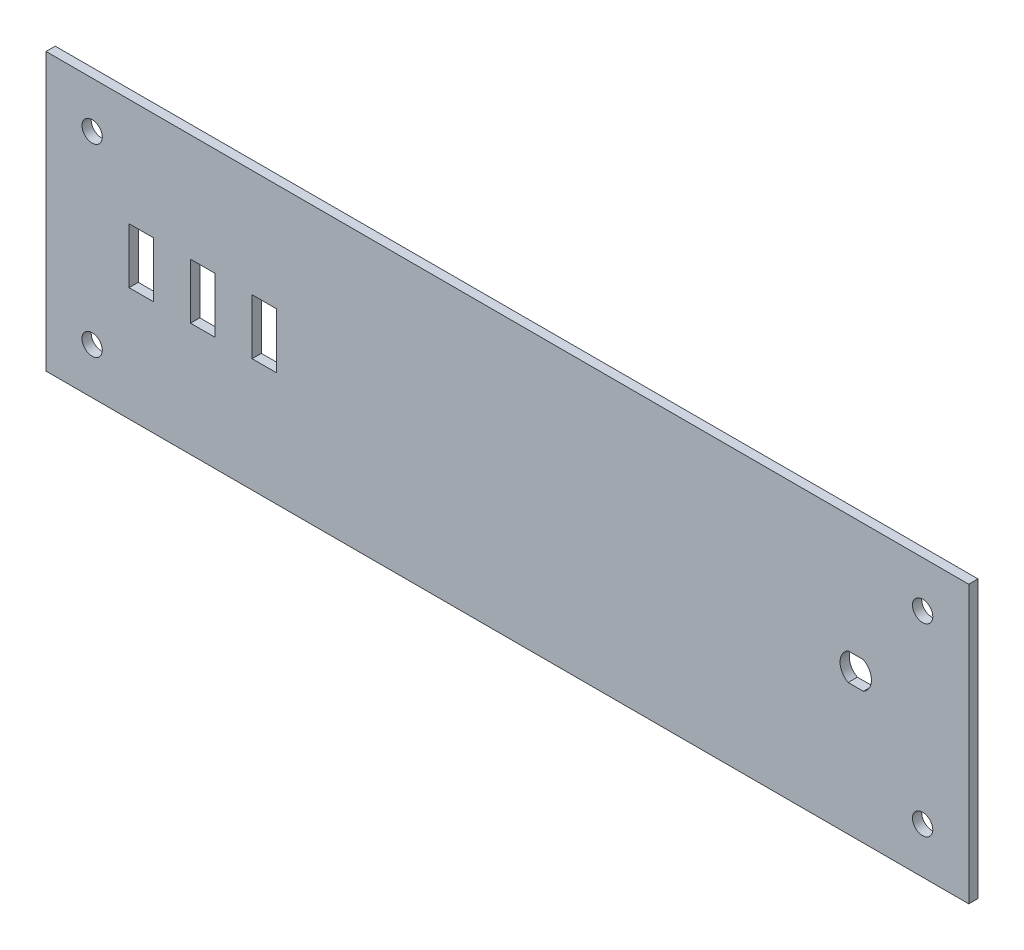
ISO-10303-21;
HEADER;
FILE_DESCRIPTION(('STEP AP214'),'2;1');
FILE_NAME('part.step','',(''),(''),'','','');
FILE_SCHEMA(('AUTOMOTIVE_DESIGN { 1 0 10303 214 1 1 1 1 }'));
ENDSEC;
DATA;
#1=APPLICATION_CONTEXT('core data for automotive mechanical design processes');
#2=APPLICATION_PROTOCOL_DEFINITION('international standard','automotive_design',2000,#1);
#3=PRODUCT_CONTEXT('',#1,'mechanical');
#4=PRODUCT('Part','Part','',(#3));
#5=PRODUCT_RELATED_PRODUCT_CATEGORY('part','',(#4));
#6=PRODUCT_DEFINITION_FORMATION('','',#4);
#7=PRODUCT_DEFINITION_CONTEXT('part definition',#1,'design');
#8=PRODUCT_DEFINITION('design','',#6,#7);
#9=PRODUCT_DEFINITION_SHAPE('','',#8);
#10=(LENGTH_UNIT() NAMED_UNIT(*) SI_UNIT(.MILLI.,.METRE.));
#11=(NAMED_UNIT(*) PLANE_ANGLE_UNIT() SI_UNIT($,.RADIAN.));
#12=(NAMED_UNIT(*) SI_UNIT($,.STERADIAN.) SOLID_ANGLE_UNIT());
#13=UNCERTAINTY_MEASURE_WITH_UNIT(LENGTH_MEASURE(1.E-05),#10,'distance_accuracy_value','');
#14=(GEOMETRIC_REPRESENTATION_CONTEXT(3) GLOBAL_UNCERTAINTY_ASSIGNED_CONTEXT((#13)) GLOBAL_UNIT_ASSIGNED_CONTEXT((#10,
#11,#12)) REPRESENTATION_CONTEXT('',''));
#15=CARTESIAN_POINT('',(0.,0.,0.));
#16=DIRECTION('',(0.,0.,1.));
#17=DIRECTION('',(1.,0.,0.));
#18=AXIS2_PLACEMENT_3D('',#15,#16,#17);
#19=CARTESIAN_POINT('',(-300.,15.0007500092795,3.));
#20=DIRECTION('',(1.,0.,0.));
#21=DIRECTION('',(0.,0.,-1.));
#22=AXIS2_PLACEMENT_3D('',#19,#20,#21);
#23=PLANE('',#22);
#24=DIRECTION('',(0.,-1.,0.));
#25=VECTOR('',#24,1.);
#26=CARTESIAN_POINT('',(-300.,15.0007500092795,0.));
#27=LINE('',#26,#25);
#28=CARTESIAN_POINT('',(-300.,15.0007500092795,0.));
#29=VERTEX_POINT('',#28);
#30=CARTESIAN_POINT('',(-300.,-75.0007499907151,0.));
#31=VERTEX_POINT('',#30);
#32=EDGE_CURVE('E281',#29,#31,#27,.T.);
#33=ORIENTED_EDGE('',*,*,#32,.T.);
#34=DIRECTION('',(0.,0.,-1.));
#35=VECTOR('',#34,1.);
#36=CARTESIAN_POINT('',(-300.,-75.0007499907151,3.));
#37=LINE('',#36,#35);
#38=CARTESIAN_POINT('',(-300.,-75.0007499907151,3.));
#39=VERTEX_POINT('',#38);
#40=EDGE_CURVE('E310',#39,#31,#37,.T.);
#41=ORIENTED_EDGE('',*,*,#40,.F.);
#42=DIRECTION('',(0.,-1.,0.));
#43=VECTOR('',#42,1.);
#44=CARTESIAN_POINT('',(-300.,15.0007500092795,3.));
#45=LINE('',#44,#43);
#46=CARTESIAN_POINT('',(-300.,15.0007500092795,3.));
#47=VERTEX_POINT('',#46);
#48=EDGE_CURVE('E282',#47,#39,#45,.T.);
#49=ORIENTED_EDGE('',*,*,#48,.F.);
#50=DIRECTION('',(0.,0.,-1.));
#51=VECTOR('',#50,1.);
#52=CARTESIAN_POINT('',(-300.,15.0007500092795,3.));
#53=LINE('',#52,#51);
#54=EDGE_CURVE('E294',#47,#29,#53,.T.);
#55=ORIENTED_EDGE('',*,*,#54,.T.);
#56=EDGE_LOOP('',(#33,#41,#49,#55));
#57=FACE_BOUND('',#56,.T.);
#58=ADVANCED_FACE('F33',(#57),#23,.F.);
#59=CARTESIAN_POINT('',(-300.,-75.0007499907151,3.));
#60=DIRECTION('',(0.,1.,0.));
#61=DIRECTION('',(0.,0.,1.));
#62=AXIS2_PLACEMENT_3D('',#59,#60,#61);
#63=PLANE('',#62);
#64=DIRECTION('',(1.,0.,0.));
#65=VECTOR('',#64,1.);
#66=CARTESIAN_POINT('',(-300.,-75.0007499907151,0.));
#67=LINE('',#66,#65);
#68=CARTESIAN_POINT('',(0.,-75.0007499907151,0.));
#69=VERTEX_POINT('',#68);
#70=EDGE_CURVE('E297',#31,#69,#67,.T.);
#71=ORIENTED_EDGE('',*,*,#70,.T.);
#72=DIRECTION('',(0.,0.,-1.));
#73=VECTOR('',#72,1.);
#74=CARTESIAN_POINT('',(0.,-75.0007499907151,3.));
#75=LINE('',#74,#73);
#76=CARTESIAN_POINT('',(0.,-75.0007499907151,3.));
#77=VERTEX_POINT('',#76);
#78=EDGE_CURVE('E308',#77,#69,#75,.T.);
#79=ORIENTED_EDGE('',*,*,#78,.F.);
#80=DIRECTION('',(1.,0.,0.));
#81=VECTOR('',#80,1.);
#82=CARTESIAN_POINT('',(-300.,-75.0007499907151,3.));
#83=LINE('',#82,#81);
#84=EDGE_CURVE('E285',#39,#77,#83,.T.);
#85=ORIENTED_EDGE('',*,*,#84,.F.);
#86=ORIENTED_EDGE('',*,*,#40,.T.);
#87=EDGE_LOOP('',(#71,#79,#85,#86));
#88=FACE_BOUND('',#87,.T.);
#89=ADVANCED_FACE('F373',(#88),#63,.F.);
#90=CARTESIAN_POINT('',(0.,15.0007500092795,3.));
#91=DIRECTION('',(1.,0.,0.));
#92=DIRECTION('',(0.,0.,-1.));
#93=AXIS2_PLACEMENT_3D('',#90,#91,#92);
#94=PLANE('',#93);
#95=DIRECTION('',(0.,-1.,0.));
#96=VECTOR('',#95,1.);
#97=CARTESIAN_POINT('',(0.,15.0007500092795,0.));
#98=LINE('',#97,#96);
#99=CARTESIAN_POINT('',(0.,15.0007500092795,0.));
#100=VERTEX_POINT('',#99);
#101=EDGE_CURVE('E300',#100,#69,#98,.T.);
#102=ORIENTED_EDGE('',*,*,#101,.F.);
#103=DIRECTION('',(0.,0.,-1.));
#104=VECTOR('',#103,1.);
#105=CARTESIAN_POINT('',(0.,15.0007500092795,3.));
#106=LINE('',#105,#104);
#107=CARTESIAN_POINT('',(0.,15.0007500092795,3.));
#108=VERTEX_POINT('',#107);
#109=EDGE_CURVE('E306',#108,#100,#106,.T.);
#110=ORIENTED_EDGE('',*,*,#109,.F.);
#111=DIRECTION('',(0.,-1.,0.));
#112=VECTOR('',#111,1.);
#113=CARTESIAN_POINT('',(0.,15.0007500092795,3.));
#114=LINE('',#113,#112);
#115=EDGE_CURVE('E288',#108,#77,#114,.T.);
#116=ORIENTED_EDGE('',*,*,#115,.T.);
#117=ORIENTED_EDGE('',*,*,#78,.T.);
#118=EDGE_LOOP('',(#102,#110,#116,#117));
#119=FACE_BOUND('',#118,.T.);
#120=ADVANCED_FACE('F378',(#119),#94,.T.);
#121=CARTESIAN_POINT('',(-300.,15.0007500092795,3.));
#122=DIRECTION('',(0.,1.,0.));
#123=DIRECTION('',(0.,0.,1.));
#124=AXIS2_PLACEMENT_3D('',#121,#122,#123);
#125=PLANE('',#124);
#126=DIRECTION('',(1.,0.,0.));
#127=VECTOR('',#126,1.);
#128=CARTESIAN_POINT('',(-300.,15.0007500092795,0.));
#129=LINE('',#128,#127);
#130=EDGE_CURVE('E286',#29,#100,#129,.T.);
#131=ORIENTED_EDGE('',*,*,#130,.F.);
#132=ORIENTED_EDGE('',*,*,#54,.F.);
#133=DIRECTION('',(1.,0.,0.));
#134=VECTOR('',#133,1.);
#135=CARTESIAN_POINT('',(-300.,15.0007500092795,3.));
#136=LINE('',#135,#134);
#137=EDGE_CURVE('E291',#47,#108,#136,.T.);
#138=ORIENTED_EDGE('',*,*,#137,.T.);
#139=ORIENTED_EDGE('',*,*,#109,.T.);
#140=EDGE_LOOP('',(#131,#132,#138,#139));
#141=FACE_BOUND('',#140,.T.);
#142=ADVANCED_FACE('F386',(#141),#125,.T.);
#143=CARTESIAN_POINT('',(0.,0.,3.));
#144=DIRECTION('',(0.,0.,1.));
#145=DIRECTION('',(1.,0.,0.));
#146=AXIS2_PLACEMENT_3D('',#143,#144,#145);
#147=PLANE('',#146);
#148=CARTESIAN_POINT('',(-36.7467376716554,-27.8300726435288,3.));
#149=DIRECTION('',(0.,0.,1.));
#150=DIRECTION('',(1.,0.,0.));
#151=AXIS2_PLACEMENT_3D('',#148,#149,#150);
#152=CIRCLE('',#151,5.1);
#153=CARTESIAN_POINT('',(-34.2552521709952,-32.2800726435288,3.));
#154=VERTEX_POINT('',#153);
#155=CARTESIAN_POINT('',(-34.2552521709952,-23.3800726435288,3.));
#156=VERTEX_POINT('',#155);
#157=EDGE_CURVE('E47',#154,#156,#152,.T.);
#158=ORIENTED_EDGE('',*,*,#157,.F.);
#159=DIRECTION('',(1.,0.,0.));
#160=VECTOR('',#159,1.);
#161=CARTESIAN_POINT('',(-34.2552521709952,-32.2800726435288,3.));
#162=LINE('',#161,#160);
#163=CARTESIAN_POINT('',(-39.2382231723156,-32.2800726435288,3.));
#164=VERTEX_POINT('',#163);
#165=EDGE_CURVE('E188',#164,#154,#162,.T.);
#166=ORIENTED_EDGE('',*,*,#165,.F.);
#167=CARTESIAN_POINT('',(-36.7467376716554,-27.8300726435288,3.));
#168=DIRECTION('',(0.,0.,1.));
#169=DIRECTION('',(1.,0.,0.));
#170=AXIS2_PLACEMENT_3D('',#167,#168,#169);
#171=CIRCLE('',#170,5.1);
#172=CARTESIAN_POINT('',(-39.2382231723156,-23.3800726435288,3.));
#173=VERTEX_POINT('',#172);
#174=EDGE_CURVE('E172',#173,#164,#171,.T.);
#175=ORIENTED_EDGE('',*,*,#174,.F.);
#176=DIRECTION('',(-1.,0.,0.));
#177=VECTOR('',#176,1.);
#178=CARTESIAN_POINT('',(-34.2552521709952,-23.3800726435288,3.));
#179=LINE('',#178,#177);
#180=EDGE_CURVE('E181',#156,#173,#179,.T.);
#181=ORIENTED_EDGE('',*,*,#180,.F.);
#182=EDGE_LOOP('',(#158,#166,#175,#181));
#183=FACE_BOUND('',#182,.T.);
#184=DIRECTION('',(0.,1.,0.));
#185=VECTOR('',#184,1.);
#186=CARTESIAN_POINT('',(-265.,-19.9992499907157,3.));
#187=LINE('',#186,#185);
#188=CARTESIAN_POINT('',(-265.,-37.9992499907156,3.));
#189=VERTEX_POINT('',#188);
#190=CARTESIAN_POINT('',(-265.,-19.9992499907157,3.));
#191=VERTEX_POINT('',#190);
#192=EDGE_CURVE('E198',#189,#191,#187,.T.);
#193=ORIENTED_EDGE('',*,*,#192,.F.);
#194=DIRECTION('',(1.,0.,0.));
#195=VECTOR('',#194,1.);
#196=CARTESIAN_POINT('',(-265.,-37.9992499907156,3.));
#197=LINE('',#196,#195);
#198=CARTESIAN_POINT('',(-273.,-37.9992499907156,3.));
#199=VERTEX_POINT('',#198);
#200=EDGE_CURVE('E207',#199,#189,#197,.T.);
#201=ORIENTED_EDGE('',*,*,#200,.F.);
#202=DIRECTION('',(0.,-1.,0.));
#203=VECTOR('',#202,1.);
#204=CARTESIAN_POINT('',(-273.,-19.9992499907157,3.));
#205=LINE('',#204,#203);
#206=CARTESIAN_POINT('',(-273.,-19.9992499907157,3.));
#207=VERTEX_POINT('',#206);
#208=EDGE_CURVE('E204',#207,#199,#205,.T.);
#209=ORIENTED_EDGE('',*,*,#208,.F.);
#210=DIRECTION('',(-1.,0.,0.));
#211=VECTOR('',#210,1.);
#212=CARTESIAN_POINT('',(-265.,-19.9992499907157,3.));
#213=LINE('',#212,#211);
#214=EDGE_CURVE('E200',#191,#207,#213,.T.);
#215=ORIENTED_EDGE('',*,*,#214,.F.);
#216=EDGE_LOOP('',(#193,#201,#209,#215));
#217=FACE_BOUND('',#216,.T.);
#218=DIRECTION('',(-1.,0.,0.));
#219=VECTOR('',#218,1.);
#220=CARTESIAN_POINT('',(-245.,-19.9992499907157,3.));
#221=LINE('',#220,#219);
#222=CARTESIAN_POINT('',(-245.,-19.9992499907157,3.));
#223=VERTEX_POINT('',#222);
#224=CARTESIAN_POINT('',(-253.,-19.9992499907157,3.));
#225=VERTEX_POINT('',#224);
#226=EDGE_CURVE('E220',#223,#225,#221,.T.);
#227=ORIENTED_EDGE('',*,*,#226,.F.);
#228=DIRECTION('',(0.,1.,0.));
#229=VECTOR('',#228,1.);
#230=CARTESIAN_POINT('',(-245.,-19.9992499907157,3.));
#231=LINE('',#230,#229);
#232=CARTESIAN_POINT('',(-245.,-37.9992499907156,3.));
#233=VERTEX_POINT('',#232);
#234=EDGE_CURVE('E229',#233,#223,#231,.T.);
#235=ORIENTED_EDGE('',*,*,#234,.F.);
#236=DIRECTION('',(1.,0.,0.));
#237=VECTOR('',#236,1.);
#238=CARTESIAN_POINT('',(-245.,-37.9992499907156,3.));
#239=LINE('',#238,#237);
#240=CARTESIAN_POINT('',(-253.,-37.9992499907156,3.));
#241=VERTEX_POINT('',#240);
#242=EDGE_CURVE('E226',#241,#233,#239,.T.);
#243=ORIENTED_EDGE('',*,*,#242,.F.);
#244=DIRECTION('',(0.,-1.,0.));
#245=VECTOR('',#244,1.);
#246=CARTESIAN_POINT('',(-253.,-19.9992499907157,3.));
#247=LINE('',#246,#245);
#248=EDGE_CURVE('E222',#225,#241,#247,.T.);
#249=ORIENTED_EDGE('',*,*,#248,.F.);
#250=EDGE_LOOP('',(#227,#235,#243,#249));
#251=FACE_BOUND('',#250,.T.);
#252=DIRECTION('',(-1.,0.,0.));
#253=VECTOR('',#252,1.);
#254=CARTESIAN_POINT('',(-225.,-19.9992499907157,3.));
#255=LINE('',#254,#253);
#256=CARTESIAN_POINT('',(-225.,-19.9992499907157,3.));
#257=VERTEX_POINT('',#256);
#258=CARTESIAN_POINT('',(-233.,-19.9992499907157,3.));
#259=VERTEX_POINT('',#258);
#260=EDGE_CURVE('E195',#257,#259,#255,.T.);
#261=ORIENTED_EDGE('',*,*,#260,.F.);
#262=DIRECTION('',(0.,1.,0.));
#263=VECTOR('',#262,1.);
#264=CARTESIAN_POINT('',(-225.,-19.9992499907157,3.));
#265=LINE('',#264,#263);
#266=CARTESIAN_POINT('',(-225.,-37.9992499907156,3.));
#267=VERTEX_POINT('',#266);
#268=EDGE_CURVE('E247',#267,#257,#265,.T.);
#269=ORIENTED_EDGE('',*,*,#268,.F.);
#270=DIRECTION('',(1.,0.,0.));
#271=VECTOR('',#270,1.);
#272=CARTESIAN_POINT('',(-225.,-37.9992499907156,3.));
#273=LINE('',#272,#271);
#274=CARTESIAN_POINT('',(-233.,-37.9992499907156,3.));
#275=VERTEX_POINT('',#274);
#276=EDGE_CURVE('E244',#275,#267,#273,.T.);
#277=ORIENTED_EDGE('',*,*,#276,.F.);
#278=DIRECTION('',(0.,-1.,0.));
#279=VECTOR('',#278,1.);
#280=CARTESIAN_POINT('',(-233.,-19.9992499907157,3.));
#281=LINE('',#280,#279);
#282=EDGE_CURVE('E241',#259,#275,#281,.T.);
#283=ORIENTED_EDGE('',*,*,#282,.F.);
#284=EDGE_LOOP('',(#261,#269,#277,#283));
#285=FACE_BOUND('',#284,.T.);
#286=CARTESIAN_POINT('',(-15.,0.000750009279487651,3.));
#287=DIRECTION('',(0.,0.,1.));
#288=DIRECTION('',(1.,0.,0.));
#289=AXIS2_PLACEMENT_3D('',#286,#287,#288);
#290=CIRCLE('',#289,3.3);
#291=CARTESIAN_POINT('',(-11.7,0.000750009279487651,3.));
#292=VERTEX_POINT('',#291);
#293=EDGE_CURVE('E213',#292,#292,#290,.T.);
#294=ORIENTED_EDGE('',*,*,#293,.F.);
#295=EDGE_LOOP('',(#294));
#296=FACE_BOUND('',#295,.T.);
#297=CARTESIAN_POINT('',(-15.,-60.0007499907151,3.));
#298=DIRECTION('',(0.,0.,1.));
#299=DIRECTION('',(1.,0.,0.));
#300=AXIS2_PLACEMENT_3D('',#297,#298,#299);
#301=CIRCLE('',#300,3.3);
#302=CARTESIAN_POINT('',(-11.7,-60.0007499907151,3.));
#303=VERTEX_POINT('',#302);
#304=EDGE_CURVE('E263',#303,#303,#301,.T.);
#305=ORIENTED_EDGE('',*,*,#304,.F.);
#306=EDGE_LOOP('',(#305));
#307=FACE_BOUND('',#306,.T.);
#308=CARTESIAN_POINT('',(-285.,-60.0007499907151,3.));
#309=DIRECTION('',(0.,0.,1.));
#310=DIRECTION('',(1.,0.,0.));
#311=AXIS2_PLACEMENT_3D('',#308,#309,#310);
#312=CIRCLE('',#311,3.30000000000003);
#313=CARTESIAN_POINT('',(-281.7,-60.0007499907151,3.));
#314=VERTEX_POINT('',#313);
#315=EDGE_CURVE('E269',#314,#314,#312,.T.);
#316=ORIENTED_EDGE('',*,*,#315,.F.);
#317=EDGE_LOOP('',(#316));
#318=FACE_BOUND('',#317,.T.);
#319=CARTESIAN_POINT('',(-285.000000000002,0.000750009286901859,3.));
#320=DIRECTION('',(0.,0.,1.));
#321=DIRECTION('',(1.,0.,0.));
#322=AXIS2_PLACEMENT_3D('',#319,#320,#321);
#323=CIRCLE('',#322,3.30000000000003);
#324=CARTESIAN_POINT('',(-281.700000000002,0.000750009286901859,3.));
#325=VERTEX_POINT('',#324);
#326=EDGE_CURVE('E275',#325,#325,#323,.T.);
#327=ORIENTED_EDGE('',*,*,#326,.F.);
#328=EDGE_LOOP('',(#327));
#329=FACE_BOUND('',#328,.T.);
#330=ORIENTED_EDGE('',*,*,#48,.T.);
#331=ORIENTED_EDGE('',*,*,#84,.T.);
#332=ORIENTED_EDGE('',*,*,#115,.F.);
#333=ORIENTED_EDGE('',*,*,#137,.F.);
#334=EDGE_LOOP('',(#330,#331,#332,#333));
#335=FACE_BOUND('',#334,.T.);
#336=ADVANCED_FACE('F185',(#183,#217,#251,#285,#296,#307,#318,#329,#335),#147,.T.);
#337=CARTESIAN_POINT('',(0.,0.,0.));
#338=DIRECTION('',(0.,0.,1.));
#339=DIRECTION('',(1.,0.,0.));
#340=AXIS2_PLACEMENT_3D('',#337,#338,#339);
#341=PLANE('',#340);
#342=DIRECTION('',(1.,0.,0.));
#343=VECTOR('',#342,1.);
#344=CARTESIAN_POINT('',(0.,-32.2800726435288,0.));
#345=LINE('',#344,#343);
#346=CARTESIAN_POINT('',(-39.2382231723156,-32.2800726435288,0.));
#347=VERTEX_POINT('',#346);
#348=CARTESIAN_POINT('',(-34.2552521709952,-32.2800726435288,0.));
#349=VERTEX_POINT('',#348);
#350=EDGE_CURVE('E40',#347,#349,#345,.T.);
#351=ORIENTED_EDGE('',*,*,#350,.T.);
#352=CARTESIAN_POINT('',(-36.7467376716554,-27.8300726435288,0.));
#353=DIRECTION('',(0.,0.,1.));
#354=DIRECTION('',(1.,0.,0.));
#355=AXIS2_PLACEMENT_3D('',#352,#353,#354);
#356=CIRCLE('',#355,5.1);
#357=CARTESIAN_POINT('',(-34.2552521709952,-23.3800726435288,0.));
#358=VERTEX_POINT('',#357);
#359=EDGE_CURVE('E11',#349,#358,#356,.T.);
#360=ORIENTED_EDGE('',*,*,#359,.T.);
#361=DIRECTION('',(-1.,0.,0.));
#362=VECTOR('',#361,1.);
#363=CARTESIAN_POINT('',(0.,-23.3800726435288,0.));
#364=LINE('',#363,#362);
#365=CARTESIAN_POINT('',(-39.2382231723156,-23.3800726435288,0.));
#366=VERTEX_POINT('',#365);
#367=EDGE_CURVE('E349',#358,#366,#364,.T.);
#368=ORIENTED_EDGE('',*,*,#367,.T.);
#369=CARTESIAN_POINT('',(-36.7467376716554,-27.8300726435288,0.));
#370=DIRECTION('',(0.,0.,1.));
#371=DIRECTION('',(1.,0.,0.));
#372=AXIS2_PLACEMENT_3D('',#369,#370,#371);
#373=CIRCLE('',#372,5.1);
#374=EDGE_CURVE('E175',#366,#347,#373,.T.);
#375=ORIENTED_EDGE('',*,*,#374,.T.);
#376=EDGE_LOOP('',(#351,#360,#368,#375));
#377=FACE_BOUND('',#376,.T.);
#378=DIRECTION('',(1.,0.,0.));
#379=VECTOR('',#378,1.);
#380=CARTESIAN_POINT('',(0.,-37.9992499907156,0.));
#381=LINE('',#380,#379);
#382=CARTESIAN_POINT('',(-273.,-37.9992499907156,0.));
#383=VERTEX_POINT('',#382);
#384=CARTESIAN_POINT('',(-265.,-37.9992499907156,0.));
#385=VERTEX_POINT('',#384);
#386=EDGE_CURVE('E343',#383,#385,#381,.T.);
#387=ORIENTED_EDGE('',*,*,#386,.T.);
#388=DIRECTION('',(0.,1.,0.));
#389=VECTOR('',#388,1.);
#390=CARTESIAN_POINT('',(-265.,0.,0.));
#391=LINE('',#390,#389);
#392=CARTESIAN_POINT('',(-265.,-19.9992499907157,0.));
#393=VERTEX_POINT('',#392);
#394=EDGE_CURVE('E346',#385,#393,#391,.T.);
#395=ORIENTED_EDGE('',*,*,#394,.T.);
#396=DIRECTION('',(-1.,0.,0.));
#397=VECTOR('',#396,1.);
#398=CARTESIAN_POINT('',(0.,-19.9992499907157,0.));
#399=LINE('',#398,#397);
#400=CARTESIAN_POINT('',(-273.,-19.9992499907157,0.));
#401=VERTEX_POINT('',#400);
#402=EDGE_CURVE('E337',#393,#401,#399,.T.);
#403=ORIENTED_EDGE('',*,*,#402,.T.);
#404=DIRECTION('',(0.,-1.,0.));
#405=VECTOR('',#404,1.);
#406=CARTESIAN_POINT('',(-273.,0.,0.));
#407=LINE('',#406,#405);
#408=EDGE_CURVE('E340',#401,#383,#407,.T.);
#409=ORIENTED_EDGE('',*,*,#408,.T.);
#410=EDGE_LOOP('',(#387,#395,#403,#409));
#411=FACE_BOUND('',#410,.T.);
#412=DIRECTION('',(0.,1.,0.));
#413=VECTOR('',#412,1.);
#414=CARTESIAN_POINT('',(-245.,0.,0.));
#415=LINE('',#414,#413);
#416=CARTESIAN_POINT('',(-245.,-37.9992499907156,0.));
#417=VERTEX_POINT('',#416);
#418=CARTESIAN_POINT('',(-245.,-19.9992499907157,0.));
#419=VERTEX_POINT('',#418);
#420=EDGE_CURVE('E331',#417,#419,#415,.T.);
#421=ORIENTED_EDGE('',*,*,#420,.T.);
#422=DIRECTION('',(-1.,0.,0.));
#423=VECTOR('',#422,1.);
#424=CARTESIAN_POINT('',(0.,-19.9992499907157,0.));
#425=LINE('',#424,#423);
#426=CARTESIAN_POINT('',(-253.,-19.9992499907157,0.));
#427=VERTEX_POINT('',#426);
#428=EDGE_CURVE('E334',#419,#427,#425,.T.);
#429=ORIENTED_EDGE('',*,*,#428,.T.);
#430=DIRECTION('',(0.,-1.,0.));
#431=VECTOR('',#430,1.);
#432=CARTESIAN_POINT('',(-253.,0.,0.));
#433=LINE('',#432,#431);
#434=CARTESIAN_POINT('',(-253.,-37.9992499907156,0.));
#435=VERTEX_POINT('',#434);
#436=EDGE_CURVE('E325',#427,#435,#433,.T.);
#437=ORIENTED_EDGE('',*,*,#436,.T.);
#438=DIRECTION('',(1.,0.,0.));
#439=VECTOR('',#438,1.);
#440=CARTESIAN_POINT('',(0.,-37.9992499907156,0.));
#441=LINE('',#440,#439);
#442=EDGE_CURVE('E328',#435,#417,#441,.T.);
#443=ORIENTED_EDGE('',*,*,#442,.T.);
#444=EDGE_LOOP('',(#421,#429,#437,#443));
#445=FACE_BOUND('',#444,.T.);
#446=DIRECTION('',(0.,1.,0.));
#447=VECTOR('',#446,1.);
#448=CARTESIAN_POINT('',(-225.,0.,0.));
#449=LINE('',#448,#447);
#450=CARTESIAN_POINT('',(-225.,-37.9992499907156,0.));
#451=VERTEX_POINT('',#450);
#452=CARTESIAN_POINT('',(-225.,-19.9992499907157,0.));
#453=VERTEX_POINT('',#452);
#454=EDGE_CURVE('E319',#451,#453,#449,.T.);
#455=ORIENTED_EDGE('',*,*,#454,.T.);
#456=DIRECTION('',(-1.,0.,0.));
#457=VECTOR('',#456,1.);
#458=CARTESIAN_POINT('',(0.,-19.9992499907157,0.));
#459=LINE('',#458,#457);
#460=CARTESIAN_POINT('',(-233.,-19.9992499907157,0.));
#461=VERTEX_POINT('',#460);
#462=EDGE_CURVE('E322',#453,#461,#459,.T.);
#463=ORIENTED_EDGE('',*,*,#462,.T.);
#464=DIRECTION('',(0.,-1.,0.));
#465=VECTOR('',#464,1.);
#466=CARTESIAN_POINT('',(-233.,0.,0.));
#467=LINE('',#466,#465);
#468=CARTESIAN_POINT('',(-233.,-37.9992499907156,0.));
#469=VERTEX_POINT('',#468);
#470=EDGE_CURVE('E313',#461,#469,#467,.T.);
#471=ORIENTED_EDGE('',*,*,#470,.T.);
#472=DIRECTION('',(1.,0.,0.));
#473=VECTOR('',#472,1.);
#474=CARTESIAN_POINT('',(0.,-37.9992499907156,0.));
#475=LINE('',#474,#473);
#476=EDGE_CURVE('E316',#469,#451,#475,.T.);
#477=ORIENTED_EDGE('',*,*,#476,.T.);
#478=EDGE_LOOP('',(#455,#463,#471,#477));
#479=FACE_BOUND('',#478,.T.);
#480=CARTESIAN_POINT('',(-15.,0.000750009279487651,0.));
#481=DIRECTION('',(0.,0.,1.));
#482=DIRECTION('',(1.,0.,0.));
#483=AXIS2_PLACEMENT_3D('',#480,#481,#482);
#484=CIRCLE('',#483,3.3);
#485=CARTESIAN_POINT('',(-11.7,0.000750009279487651,0.));
#486=VERTEX_POINT('',#485);
#487=EDGE_CURVE('E260',#486,#486,#484,.T.);
#488=ORIENTED_EDGE('',*,*,#487,.T.);
#489=EDGE_LOOP('',(#488));
#490=FACE_BOUND('',#489,.T.);
#491=CARTESIAN_POINT('',(-15.,-60.0007499907151,0.));
#492=DIRECTION('',(0.,0.,1.));
#493=DIRECTION('',(1.,0.,0.));
#494=AXIS2_PLACEMENT_3D('',#491,#492,#493);
#495=CIRCLE('',#494,3.3);
#496=CARTESIAN_POINT('',(-11.7,-60.0007499907151,0.));
#497=VERTEX_POINT('',#496);
#498=EDGE_CURVE('E266',#497,#497,#495,.T.);
#499=ORIENTED_EDGE('',*,*,#498,.T.);
#500=EDGE_LOOP('',(#499));
#501=FACE_BOUND('',#500,.T.);
#502=CARTESIAN_POINT('',(-285.,-60.0007499907151,0.));
#503=DIRECTION('',(0.,0.,1.));
#504=DIRECTION('',(1.,0.,0.));
#505=AXIS2_PLACEMENT_3D('',#502,#503,#504);
#506=CIRCLE('',#505,3.30000000000003);
#507=CARTESIAN_POINT('',(-281.7,-60.0007499907151,0.));
#508=VERTEX_POINT('',#507);
#509=EDGE_CURVE('E272',#508,#508,#506,.T.);
#510=ORIENTED_EDGE('',*,*,#509,.T.);
#511=EDGE_LOOP('',(#510));
#512=FACE_BOUND('',#511,.T.);
#513=CARTESIAN_POINT('',(-285.000000000002,0.000750009286901859,0.));
#514=DIRECTION('',(0.,0.,1.));
#515=DIRECTION('',(1.,0.,0.));
#516=AXIS2_PLACEMENT_3D('',#513,#514,#515);
#517=CIRCLE('',#516,3.30000000000003);
#518=CARTESIAN_POINT('',(-281.700000000002,0.000750009286901859,0.));
#519=VERTEX_POINT('',#518);
#520=EDGE_CURVE('E278',#519,#519,#517,.T.);
#521=ORIENTED_EDGE('',*,*,#520,.T.);
#522=EDGE_LOOP('',(#521));
#523=FACE_BOUND('',#522,.T.);
#524=ORIENTED_EDGE('',*,*,#32,.F.);
#525=ORIENTED_EDGE('',*,*,#130,.T.);
#526=ORIENTED_EDGE('',*,*,#101,.T.);
#527=ORIENTED_EDGE('',*,*,#70,.F.);
#528=EDGE_LOOP('',(#524,#525,#526,#527));
#529=FACE_BOUND('',#528,.T.);
#530=ADVANCED_FACE('F353',(#377,#411,#445,#479,#490,#501,#512,#523,#529),#341,.F.);
#531=CARTESIAN_POINT('',(-285.000000000002,0.000750009286901859,3.));
#532=DIRECTION('',(0.,0.,1.));
#533=DIRECTION('',(1.,0.,0.));
#534=AXIS2_PLACEMENT_3D('',#531,#532,#533);
#535=CYLINDRICAL_SURFACE('',#534,3.30000000000003);
#536=ORIENTED_EDGE('',*,*,#520,.F.);
#537=EDGE_LOOP('',(#536));
#538=FACE_BOUND('',#537,.T.);
#539=ORIENTED_EDGE('',*,*,#326,.T.);
#540=EDGE_LOOP('',(#539));
#541=FACE_BOUND('',#540,.T.);
#542=ADVANCED_FACE('F399',(#538,#541),#535,.F.);
#543=CARTESIAN_POINT('',(-285.,-60.0007499907151,3.));
#544=DIRECTION('',(0.,0.,1.));
#545=DIRECTION('',(1.,0.,0.));
#546=AXIS2_PLACEMENT_3D('',#543,#544,#545);
#547=CYLINDRICAL_SURFACE('',#546,3.30000000000003);
#548=ORIENTED_EDGE('',*,*,#509,.F.);
#549=EDGE_LOOP('',(#548));
#550=FACE_BOUND('',#549,.T.);
#551=ORIENTED_EDGE('',*,*,#315,.T.);
#552=EDGE_LOOP('',(#551));
#553=FACE_BOUND('',#552,.T.);
#554=ADVANCED_FACE('F424',(#550,#553),#547,.F.);
#555=CARTESIAN_POINT('',(-15.,-60.0007499907151,3.));
#556=DIRECTION('',(0.,0.,1.));
#557=DIRECTION('',(1.,0.,0.));
#558=AXIS2_PLACEMENT_3D('',#555,#556,#557);
#559=CYLINDRICAL_SURFACE('',#558,3.3);
#560=ORIENTED_EDGE('',*,*,#498,.F.);
#561=EDGE_LOOP('',(#560));
#562=FACE_BOUND('',#561,.T.);
#563=ORIENTED_EDGE('',*,*,#304,.T.);
#564=EDGE_LOOP('',(#563));
#565=FACE_BOUND('',#564,.T.);
#566=ADVANCED_FACE('F434',(#562,#565),#559,.F.);
#567=CARTESIAN_POINT('',(-15.,0.000750009279487651,3.));
#568=DIRECTION('',(0.,0.,1.));
#569=DIRECTION('',(1.,0.,0.));
#570=AXIS2_PLACEMENT_3D('',#567,#568,#569);
#571=CYLINDRICAL_SURFACE('',#570,3.3);
#572=ORIENTED_EDGE('',*,*,#487,.F.);
#573=EDGE_LOOP('',(#572));
#574=FACE_BOUND('',#573,.T.);
#575=ORIENTED_EDGE('',*,*,#293,.T.);
#576=EDGE_LOOP('',(#575));
#577=FACE_BOUND('',#576,.T.);
#578=ADVANCED_FACE('F443',(#574,#577),#571,.F.);
#579=CARTESIAN_POINT('',(-225.,-19.9992499907157,-7.));
#580=DIRECTION('',(0.,1.,0.));
#581=DIRECTION('',(0.,0.,1.));
#582=AXIS2_PLACEMENT_3D('',#579,#580,#581);
#583=PLANE('',#582);
#584=DIRECTION('',(0.,0.,1.));
#585=VECTOR('',#584,1.);
#586=CARTESIAN_POINT('',(-225.,-19.9992499907157,-7.));
#587=LINE('',#586,#585);
#588=EDGE_CURVE('E223',#453,#257,#587,.T.);
#589=ORIENTED_EDGE('',*,*,#588,.T.);
#590=ORIENTED_EDGE('',*,*,#260,.T.);
#591=DIRECTION('',(0.,0.,1.));
#592=VECTOR('',#591,1.);
#593=CARTESIAN_POINT('',(-233.,-19.9992499907157,-7.));
#594=LINE('',#593,#592);
#595=EDGE_CURVE('E250',#461,#259,#594,.T.);
#596=ORIENTED_EDGE('',*,*,#595,.F.);
#597=ORIENTED_EDGE('',*,*,#462,.F.);
#598=EDGE_LOOP('',(#589,#590,#596,#597));
#599=FACE_BOUND('',#598,.T.);
#600=ADVANCED_FACE('F453',(#599),#583,.F.);
#601=CARTESIAN_POINT('',(-225.,-19.9992499907157,-7.));
#602=DIRECTION('',(1.,0.,0.));
#603=DIRECTION('',(0.,0.,-1.));
#604=AXIS2_PLACEMENT_3D('',#601,#602,#603);
#605=PLANE('',#604);
#606=DIRECTION('',(0.,0.,1.));
#607=VECTOR('',#606,1.);
#608=CARTESIAN_POINT('',(-225.,-37.9992499907156,-7.));
#609=LINE('',#608,#607);
#610=EDGE_CURVE('E252',#451,#267,#609,.T.);
#611=ORIENTED_EDGE('',*,*,#610,.T.);
#612=ORIENTED_EDGE('',*,*,#268,.T.);
#613=ORIENTED_EDGE('',*,*,#588,.F.);
#614=ORIENTED_EDGE('',*,*,#454,.F.);
#615=EDGE_LOOP('',(#611,#612,#613,#614));
#616=FACE_BOUND('',#615,.T.);
#617=ADVANCED_FACE('F463',(#616),#605,.F.);
#618=CARTESIAN_POINT('',(-225.,-37.9992499907156,-7.));
#619=DIRECTION('',(0.,-1.,0.));
#620=DIRECTION('',(0.,0.,-1.));
#621=AXIS2_PLACEMENT_3D('',#618,#619,#620);
#622=PLANE('',#621);
#623=DIRECTION('',(0.,0.,1.));
#624=VECTOR('',#623,1.);
#625=CARTESIAN_POINT('',(-233.,-37.9992499907156,-7.));
#626=LINE('',#625,#624);
#627=EDGE_CURVE('E254',#469,#275,#626,.T.);
#628=ORIENTED_EDGE('',*,*,#627,.T.);
#629=ORIENTED_EDGE('',*,*,#276,.T.);
#630=ORIENTED_EDGE('',*,*,#610,.F.);
#631=ORIENTED_EDGE('',*,*,#476,.F.);
#632=EDGE_LOOP('',(#628,#629,#630,#631));
#633=FACE_BOUND('',#632,.T.);
#634=ADVANCED_FACE('F473',(#633),#622,.F.);
#635=CARTESIAN_POINT('',(-233.,-19.9992499907157,-7.));
#636=DIRECTION('',(-1.,0.,0.));
#637=DIRECTION('',(0.,0.,1.));
#638=AXIS2_PLACEMENT_3D('',#635,#636,#637);
#639=PLANE('',#638);
#640=ORIENTED_EDGE('',*,*,#595,.T.);
#641=ORIENTED_EDGE('',*,*,#282,.T.);
#642=ORIENTED_EDGE('',*,*,#627,.F.);
#643=ORIENTED_EDGE('',*,*,#470,.F.);
#644=EDGE_LOOP('',(#640,#641,#642,#643));
#645=FACE_BOUND('',#644,.T.);
#646=ADVANCED_FACE('F483',(#645),#639,.F.);
#647=CARTESIAN_POINT('',(-245.,-19.9992499907157,-7.));
#648=DIRECTION('',(0.,1.,0.));
#649=DIRECTION('',(0.,0.,1.));
#650=AXIS2_PLACEMENT_3D('',#647,#648,#649);
#651=PLANE('',#650);
#652=DIRECTION('',(0.,0.,1.));
#653=VECTOR('',#652,1.);
#654=CARTESIAN_POINT('',(-245.,-19.9992499907157,-7.));
#655=LINE('',#654,#653);
#656=EDGE_CURVE('E201',#419,#223,#655,.T.);
#657=ORIENTED_EDGE('',*,*,#656,.T.);
#658=ORIENTED_EDGE('',*,*,#226,.T.);
#659=DIRECTION('',(0.,0.,1.));
#660=VECTOR('',#659,1.);
#661=CARTESIAN_POINT('',(-253.,-19.9992499907157,-7.));
#662=LINE('',#661,#660);
#663=EDGE_CURVE('E232',#427,#225,#662,.T.);
#664=ORIENTED_EDGE('',*,*,#663,.F.);
#665=ORIENTED_EDGE('',*,*,#428,.F.);
#666=EDGE_LOOP('',(#657,#658,#664,#665));
#667=FACE_BOUND('',#666,.T.);
#668=ADVANCED_FACE('F493',(#667),#651,.F.);
#669=CARTESIAN_POINT('',(-245.,-19.9992499907157,-7.));
#670=DIRECTION('',(1.,0.,0.));
#671=DIRECTION('',(0.,0.,-1.));
#672=AXIS2_PLACEMENT_3D('',#669,#670,#671);
#673=PLANE('',#672);
#674=DIRECTION('',(0.,0.,1.));
#675=VECTOR('',#674,1.);
#676=CARTESIAN_POINT('',(-245.,-37.9992499907156,-7.));
#677=LINE('',#676,#675);
#678=EDGE_CURVE('E234',#417,#233,#677,.T.);
#679=ORIENTED_EDGE('',*,*,#678,.T.);
#680=ORIENTED_EDGE('',*,*,#234,.T.);
#681=ORIENTED_EDGE('',*,*,#656,.F.);
#682=ORIENTED_EDGE('',*,*,#420,.F.);
#683=EDGE_LOOP('',(#679,#680,#681,#682));
#684=FACE_BOUND('',#683,.T.);
#685=ADVANCED_FACE('F503',(#684),#673,.F.);
#686=CARTESIAN_POINT('',(-245.,-37.9992499907156,-7.));
#687=DIRECTION('',(0.,-1.,0.));
#688=DIRECTION('',(0.,0.,-1.));
#689=AXIS2_PLACEMENT_3D('',#686,#687,#688);
#690=PLANE('',#689);
#691=DIRECTION('',(0.,0.,1.));
#692=VECTOR('',#691,1.);
#693=CARTESIAN_POINT('',(-253.,-37.9992499907156,-7.));
#694=LINE('',#693,#692);
#695=EDGE_CURVE('E236',#435,#241,#694,.T.);
#696=ORIENTED_EDGE('',*,*,#695,.T.);
#697=ORIENTED_EDGE('',*,*,#242,.T.);
#698=ORIENTED_EDGE('',*,*,#678,.F.);
#699=ORIENTED_EDGE('',*,*,#442,.F.);
#700=EDGE_LOOP('',(#696,#697,#698,#699));
#701=FACE_BOUND('',#700,.T.);
#702=ADVANCED_FACE('F513',(#701),#690,.F.);
#703=CARTESIAN_POINT('',(-253.,-19.9992499907157,-7.));
#704=DIRECTION('',(-1.,0.,0.));
#705=DIRECTION('',(0.,0.,1.));
#706=AXIS2_PLACEMENT_3D('',#703,#704,#705);
#707=PLANE('',#706);
#708=ORIENTED_EDGE('',*,*,#663,.T.);
#709=ORIENTED_EDGE('',*,*,#248,.T.);
#710=ORIENTED_EDGE('',*,*,#695,.F.);
#711=ORIENTED_EDGE('',*,*,#436,.F.);
#712=EDGE_LOOP('',(#708,#709,#710,#711));
#713=FACE_BOUND('',#712,.T.);
#714=ADVANCED_FACE('F523',(#713),#707,.F.);
#715=CARTESIAN_POINT('',(-265.,-19.9992499907157,-7.));
#716=DIRECTION('',(1.,0.,0.));
#717=DIRECTION('',(0.,0.,-1.));
#718=AXIS2_PLACEMENT_3D('',#715,#716,#717);
#719=PLANE('',#718);
#720=DIRECTION('',(0.,0.,1.));
#721=VECTOR('',#720,1.);
#722=CARTESIAN_POINT('',(-265.,-37.9992499907156,-7.));
#723=LINE('',#722,#721);
#724=EDGE_CURVE('E211',#385,#189,#723,.T.);
#725=ORIENTED_EDGE('',*,*,#724,.T.);
#726=ORIENTED_EDGE('',*,*,#192,.T.);
#727=DIRECTION('',(0.,0.,1.));
#728=VECTOR('',#727,1.);
#729=CARTESIAN_POINT('',(-265.,-19.9992499907157,-7.));
#730=LINE('',#729,#728);
#731=EDGE_CURVE('E210',#393,#191,#730,.T.);
#732=ORIENTED_EDGE('',*,*,#731,.F.);
#733=ORIENTED_EDGE('',*,*,#394,.F.);
#734=EDGE_LOOP('',(#725,#726,#732,#733));
#735=FACE_BOUND('',#734,.T.);
#736=ADVANCED_FACE('F533',(#735),#719,.F.);
#737=CARTESIAN_POINT('',(-265.,-37.9992499907156,-7.));
#738=DIRECTION('',(0.,-1.,0.));
#739=DIRECTION('',(0.,0.,-1.));
#740=AXIS2_PLACEMENT_3D('',#737,#738,#739);
#741=PLANE('',#740);
#742=DIRECTION('',(0.,0.,1.));
#743=VECTOR('',#742,1.);
#744=CARTESIAN_POINT('',(-273.,-37.9992499907156,-7.));
#745=LINE('',#744,#743);
#746=EDGE_CURVE('E214',#383,#199,#745,.T.);
#747=ORIENTED_EDGE('',*,*,#746,.T.);
#748=ORIENTED_EDGE('',*,*,#200,.T.);
#749=ORIENTED_EDGE('',*,*,#724,.F.);
#750=ORIENTED_EDGE('',*,*,#386,.F.);
#751=EDGE_LOOP('',(#747,#748,#749,#750));
#752=FACE_BOUND('',#751,.T.);
#753=ADVANCED_FACE('F543',(#752),#741,.F.);
#754=CARTESIAN_POINT('',(-273.,-19.9992499907157,-7.));
#755=DIRECTION('',(-1.,0.,0.));
#756=DIRECTION('',(0.,0.,1.));
#757=AXIS2_PLACEMENT_3D('',#754,#755,#756);
#758=PLANE('',#757);
#759=DIRECTION('',(0.,0.,1.));
#760=VECTOR('',#759,1.);
#761=CARTESIAN_POINT('',(-273.,-19.9992499907157,-7.));
#762=LINE('',#761,#760);
#763=EDGE_CURVE('E216',#401,#207,#762,.T.);
#764=ORIENTED_EDGE('',*,*,#763,.T.);
#765=ORIENTED_EDGE('',*,*,#208,.T.);
#766=ORIENTED_EDGE('',*,*,#746,.F.);
#767=ORIENTED_EDGE('',*,*,#408,.F.);
#768=EDGE_LOOP('',(#764,#765,#766,#767));
#769=FACE_BOUND('',#768,.T.);
#770=ADVANCED_FACE('F367',(#769),#758,.F.);
#771=CARTESIAN_POINT('',(-265.,-19.9992499907157,-7.));
#772=DIRECTION('',(0.,1.,0.));
#773=DIRECTION('',(0.,0.,1.));
#774=AXIS2_PLACEMENT_3D('',#771,#772,#773);
#775=PLANE('',#774);
#776=ORIENTED_EDGE('',*,*,#731,.T.);
#777=ORIENTED_EDGE('',*,*,#214,.T.);
#778=ORIENTED_EDGE('',*,*,#763,.F.);
#779=ORIENTED_EDGE('',*,*,#402,.F.);
#780=EDGE_LOOP('',(#776,#777,#778,#779));
#781=FACE_BOUND('',#780,.T.);
#782=ADVANCED_FACE('F360',(#781),#775,.F.);
#783=CARTESIAN_POINT('',(-36.7467376716554,-27.8300726435288,-7.));
#784=DIRECTION('',(0.,0.,1.));
#785=DIRECTION('',(1.,0.,0.));
#786=AXIS2_PLACEMENT_3D('',#783,#784,#785);
#787=CYLINDRICAL_SURFACE('',#786,5.1);
#788=DIRECTION('',(0.,0.,1.));
#789=VECTOR('',#788,1.);
#790=CARTESIAN_POINT('',(-34.2552521709952,-32.2800726435288,-7.));
#791=LINE('',#790,#789);
#792=EDGE_CURVE('E193',#349,#154,#791,.T.);
#793=ORIENTED_EDGE('',*,*,#792,.T.);
#794=ORIENTED_EDGE('',*,*,#157,.T.);
#795=DIRECTION('',(0.,0.,1.));
#796=VECTOR('',#795,1.);
#797=CARTESIAN_POINT('',(-34.2552521709952,-23.3800726435288,-7.));
#798=LINE('',#797,#796);
#799=EDGE_CURVE('E178',#358,#156,#798,.T.);
#800=ORIENTED_EDGE('',*,*,#799,.F.);
#801=ORIENTED_EDGE('',*,*,#359,.F.);
#802=EDGE_LOOP('',(#793,#794,#800,#801));
#803=FACE_BOUND('',#802,.T.);
#804=ADVANCED_FACE('F358',(#803),#787,.F.);
#805=CARTESIAN_POINT('',(-34.2552521709952,-32.2800726435288,-7.));
#806=DIRECTION('',(0.,-1.,0.));
#807=DIRECTION('',(0.,0.,-1.));
#808=AXIS2_PLACEMENT_3D('',#805,#806,#807);
#809=PLANE('',#808);
#810=DIRECTION('',(0.,0.,1.));
#811=VECTOR('',#810,1.);
#812=CARTESIAN_POINT('',(-39.2382231723156,-32.2800726435288,-7.));
#813=LINE('',#812,#811);
#814=EDGE_CURVE('E177',#347,#164,#813,.T.);
#815=ORIENTED_EDGE('',*,*,#814,.T.);
#816=ORIENTED_EDGE('',*,*,#165,.T.);
#817=ORIENTED_EDGE('',*,*,#792,.F.);
#818=ORIENTED_EDGE('',*,*,#350,.F.);
#819=EDGE_LOOP('',(#815,#816,#817,#818));
#820=FACE_BOUND('',#819,.T.);
#821=ADVANCED_FACE('F357',(#820),#809,.F.);
#822=CARTESIAN_POINT('',(-36.7467376716554,-27.8300726435288,-7.));
#823=DIRECTION('',(0.,0.,1.));
#824=DIRECTION('',(1.,0.,0.));
#825=AXIS2_PLACEMENT_3D('',#822,#823,#824);
#826=CYLINDRICAL_SURFACE('',#825,5.1);
#827=DIRECTION('',(0.,0.,1.));
#828=VECTOR('',#827,1.);
#829=CARTESIAN_POINT('',(-39.2382231723156,-23.3800726435288,-7.));
#830=LINE('',#829,#828);
#831=EDGE_CURVE('E55',#366,#173,#830,.T.);
#832=ORIENTED_EDGE('',*,*,#831,.T.);
#833=ORIENTED_EDGE('',*,*,#174,.T.);
#834=ORIENTED_EDGE('',*,*,#814,.F.);
#835=ORIENTED_EDGE('',*,*,#374,.F.);
#836=EDGE_LOOP('',(#832,#833,#834,#835));
#837=FACE_BOUND('',#836,.T.);
#838=ADVANCED_FACE('F169',(#837),#826,.F.);
#839=CARTESIAN_POINT('',(-34.2552521709952,-23.3800726435288,-7.));
#840=DIRECTION('',(0.,1.,0.));
#841=DIRECTION('',(0.,0.,1.));
#842=AXIS2_PLACEMENT_3D('',#839,#840,#841);
#843=PLANE('',#842);
#844=ORIENTED_EDGE('',*,*,#799,.T.);
#845=ORIENTED_EDGE('',*,*,#180,.T.);
#846=ORIENTED_EDGE('',*,*,#831,.F.);
#847=ORIENTED_EDGE('',*,*,#367,.F.);
#848=EDGE_LOOP('',(#844,#845,#846,#847));
#849=FACE_BOUND('',#848,.T.);
#850=ADVANCED_FACE('F182',(#849),#843,.F.);
#851=CLOSED_SHELL('',(#58,#89,#120,#142,#336,#530,#542,#554,#566,#578,#600,#617,#634,#646,#668,
#685,#702,#714,#736,#753,#770,#782,#804,#821,#838,#850));
#852=MANIFOLD_SOLID_BREP('B2',#851);
#853=ADVANCED_BREP_SHAPE_REPRESENTATION('',(#18,#852),#14);
#854=SHAPE_DEFINITION_REPRESENTATION(#9,#853);
ENDSEC;
END-ISO-10303-21;
